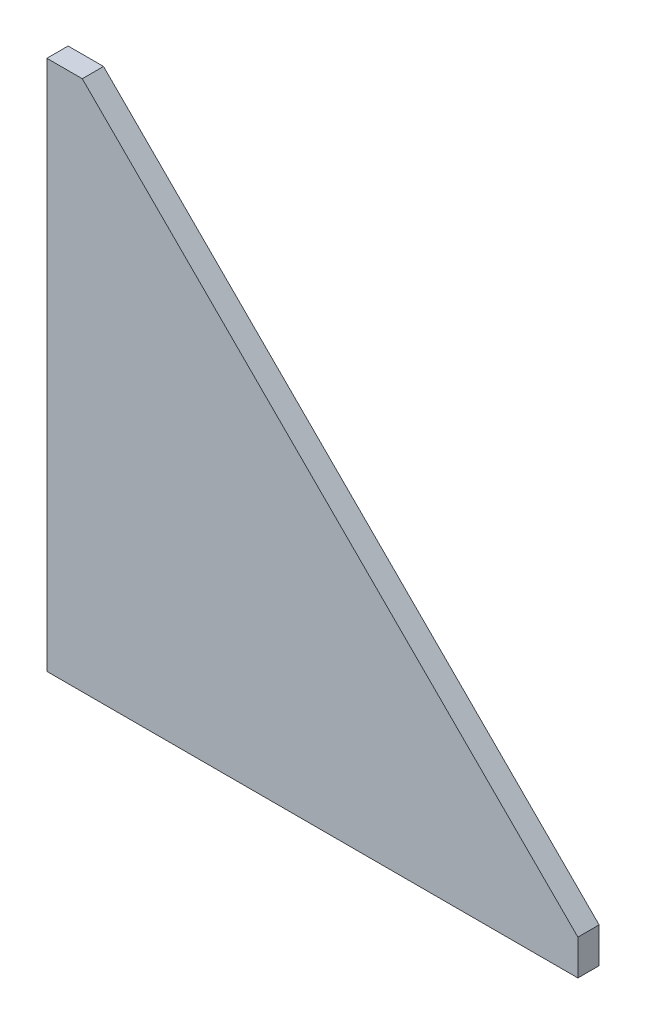
ISO-10303-21;
HEADER;
FILE_DESCRIPTION(('STEP AP214'),'2;1');
FILE_NAME('part.step','',(''),(''),'','','');
FILE_SCHEMA(('AUTOMOTIVE_DESIGN { 1 0 10303 214 1 1 1 1 }'));
ENDSEC;
DATA;
#1=APPLICATION_CONTEXT('core data for automotive mechanical design processes');
#2=APPLICATION_PROTOCOL_DEFINITION('international standard','automotive_design',2000,#1);
#3=PRODUCT_CONTEXT('',#1,'mechanical');
#4=PRODUCT('Part','Part','',(#3));
#5=PRODUCT_RELATED_PRODUCT_CATEGORY('part','',(#4));
#6=PRODUCT_DEFINITION_FORMATION('','',#4);
#7=PRODUCT_DEFINITION_CONTEXT('part definition',#1,'design');
#8=PRODUCT_DEFINITION('design','',#6,#7);
#9=PRODUCT_DEFINITION_SHAPE('','',#8);
#10=(LENGTH_UNIT() NAMED_UNIT(*) SI_UNIT(.MILLI.,.METRE.));
#11=(NAMED_UNIT(*) PLANE_ANGLE_UNIT() SI_UNIT($,.RADIAN.));
#12=(NAMED_UNIT(*) SI_UNIT($,.STERADIAN.) SOLID_ANGLE_UNIT());
#13=UNCERTAINTY_MEASURE_WITH_UNIT(LENGTH_MEASURE(1.E-05),#10,'distance_accuracy_value','');
#14=(GEOMETRIC_REPRESENTATION_CONTEXT(3) GLOBAL_UNCERTAINTY_ASSIGNED_CONTEXT((#13)) GLOBAL_UNIT_ASSIGNED_CONTEXT((#10,
#11,#12)) REPRESENTATION_CONTEXT('',''));
#15=CARTESIAN_POINT('',(0.,0.,0.));
#16=DIRECTION('',(0.,0.,1.));
#17=DIRECTION('',(1.,0.,0.));
#18=AXIS2_PLACEMENT_3D('',#15,#16,#17);
#19=CARTESIAN_POINT('',(0.,150.,-6.));
#20=DIRECTION('',(-1.,0.,0.));
#21=DIRECTION('',(0.,-1.,0.));
#22=AXIS2_PLACEMENT_3D('',#19,#20,#21);
#23=PLANE('',#22);
#24=DIRECTION('',(0.,-1.,0.));
#25=VECTOR('',#24,1.);
#26=CARTESIAN_POINT('',(0.,150.,0.));
#27=LINE('',#26,#25);
#28=CARTESIAN_POINT('',(0.,150.,0.));
#29=VERTEX_POINT('',#28);
#30=CARTESIAN_POINT('',(0.,0.,0.));
#31=VERTEX_POINT('',#30);
#32=EDGE_CURVE('E114',#29,#31,#27,.T.);
#33=ORIENTED_EDGE('',*,*,#32,.F.);
#34=DIRECTION('',(0.,0.,1.));
#35=VECTOR('',#34,1.);
#36=CARTESIAN_POINT('',(0.,150.,-6.));
#37=LINE('',#36,#35);
#38=CARTESIAN_POINT('',(0.,150.,-6.));
#39=VERTEX_POINT('',#38);
#40=EDGE_CURVE('E11',#39,#29,#37,.T.);
#41=ORIENTED_EDGE('',*,*,#40,.F.);
#42=DIRECTION('',(0.,-1.,0.));
#43=VECTOR('',#42,1.);
#44=CARTESIAN_POINT('',(0.,150.,-6.));
#45=LINE('',#44,#43);
#46=CARTESIAN_POINT('',(0.,0.,-6.));
#47=VERTEX_POINT('',#46);
#48=EDGE_CURVE('E109',#39,#47,#45,.T.);
#49=ORIENTED_EDGE('',*,*,#48,.T.);
#50=DIRECTION('',(0.,0.,1.));
#51=VECTOR('',#50,1.);
#52=CARTESIAN_POINT('',(0.,0.,-6.));
#53=LINE('',#52,#51);
#54=EDGE_CURVE('E40',#47,#31,#53,.T.);
#55=ORIENTED_EDGE('',*,*,#54,.T.);
#56=EDGE_LOOP('',(#33,#41,#49,#55));
#57=FACE_BOUND('',#56,.T.);
#58=ADVANCED_FACE('F37',(#57),#23,.T.);
#59=CARTESIAN_POINT('',(10.,150.,-6.));
#60=DIRECTION('',(0.,1.,0.));
#61=DIRECTION('',(-1.,0.,0.));
#62=AXIS2_PLACEMENT_3D('',#59,#60,#61);
#63=PLANE('',#62);
#64=DIRECTION('',(-1.,0.,0.));
#65=VECTOR('',#64,1.);
#66=CARTESIAN_POINT('',(10.,150.,0.));
#67=LINE('',#66,#65);
#68=CARTESIAN_POINT('',(10.,150.,0.));
#69=VERTEX_POINT('',#68);
#70=EDGE_CURVE('E123',#69,#29,#67,.T.);
#71=ORIENTED_EDGE('',*,*,#70,.F.);
#72=DIRECTION('',(0.,0.,1.));
#73=VECTOR('',#72,1.);
#74=CARTESIAN_POINT('',(10.,150.,-6.));
#75=LINE('',#74,#73);
#76=CARTESIAN_POINT('',(10.,150.,-6.));
#77=VERTEX_POINT('',#76);
#78=EDGE_CURVE('E46',#77,#69,#75,.T.);
#79=ORIENTED_EDGE('',*,*,#78,.F.);
#80=DIRECTION('',(-1.,0.,0.));
#81=VECTOR('',#80,1.);
#82=CARTESIAN_POINT('',(10.,150.,-6.));
#83=LINE('',#82,#81);
#84=EDGE_CURVE('E104',#77,#39,#83,.T.);
#85=ORIENTED_EDGE('',*,*,#84,.T.);
#86=ORIENTED_EDGE('',*,*,#40,.T.);
#87=EDGE_LOOP('',(#71,#79,#85,#86));
#88=FACE_BOUND('',#87,.T.);
#89=ADVANCED_FACE('F129',(#88),#63,.T.);
#90=CARTESIAN_POINT('',(150.,10.,-6.));
#91=DIRECTION('',(0.707106781186548,0.707106781186548,0.));
#92=DIRECTION('',(-0.707106781186548,0.707106781186548,0.));
#93=AXIS2_PLACEMENT_3D('',#90,#91,#92);
#94=PLANE('',#93);
#95=DIRECTION('',(-0.707106781186547,0.707106781186547,0.));
#96=VECTOR('',#95,1.);
#97=CARTESIAN_POINT('',(150.,10.,0.));
#98=LINE('',#97,#96);
#99=CARTESIAN_POINT('',(150.,10.,0.));
#100=VERTEX_POINT('',#99);
#101=EDGE_CURVE('E93',#100,#69,#98,.T.);
#102=ORIENTED_EDGE('',*,*,#101,.F.);
#103=DIRECTION('',(0.,0.,1.));
#104=VECTOR('',#103,1.);
#105=CARTESIAN_POINT('',(150.,10.,-6.));
#106=LINE('',#105,#104);
#107=CARTESIAN_POINT('',(150.,10.,-6.));
#108=VERTEX_POINT('',#107);
#109=EDGE_CURVE('E88',#108,#100,#106,.T.);
#110=ORIENTED_EDGE('',*,*,#109,.F.);
#111=DIRECTION('',(-0.707106781186547,0.707106781186547,0.));
#112=VECTOR('',#111,1.);
#113=CARTESIAN_POINT('',(150.,10.,-6.));
#114=LINE('',#113,#112);
#115=EDGE_CURVE('E91',#108,#77,#114,.T.);
#116=ORIENTED_EDGE('',*,*,#115,.T.);
#117=ORIENTED_EDGE('',*,*,#78,.T.);
#118=EDGE_LOOP('',(#102,#110,#116,#117));
#119=FACE_BOUND('',#118,.T.);
#120=ADVANCED_FACE('F90',(#119),#94,.T.);
#121=CARTESIAN_POINT('',(150.,0.,-6.));
#122=DIRECTION('',(1.,0.,0.));
#123=DIRECTION('',(0.,1.,0.));
#124=AXIS2_PLACEMENT_3D('',#121,#122,#123);
#125=PLANE('',#124);
#126=DIRECTION('',(0.,1.,0.));
#127=VECTOR('',#126,1.);
#128=CARTESIAN_POINT('',(150.,0.,0.));
#129=LINE('',#128,#127);
#130=CARTESIAN_POINT('',(150.,0.,0.));
#131=VERTEX_POINT('',#130);
#132=EDGE_CURVE('E120',#131,#100,#129,.T.);
#133=ORIENTED_EDGE('',*,*,#132,.F.);
#134=DIRECTION('',(0.,0.,1.));
#135=VECTOR('',#134,1.);
#136=CARTESIAN_POINT('',(150.,0.,-6.));
#137=LINE('',#136,#135);
#138=CARTESIAN_POINT('',(150.,0.,-6.));
#139=VERTEX_POINT('',#138);
#140=EDGE_CURVE('E98',#139,#131,#137,.T.);
#141=ORIENTED_EDGE('',*,*,#140,.F.);
#142=DIRECTION('',(0.,1.,0.));
#143=VECTOR('',#142,1.);
#144=CARTESIAN_POINT('',(150.,0.,-6.));
#145=LINE('',#144,#143);
#146=EDGE_CURVE('E103',#139,#108,#145,.T.);
#147=ORIENTED_EDGE('',*,*,#146,.T.);
#148=ORIENTED_EDGE('',*,*,#109,.T.);
#149=EDGE_LOOP('',(#133,#141,#147,#148));
#150=FACE_BOUND('',#149,.T.);
#151=ADVANCED_FACE('F106',(#150),#125,.T.);
#152=CARTESIAN_POINT('',(0.,0.,-6.));
#153=DIRECTION('',(0.,-1.,0.));
#154=DIRECTION('',(0.,0.,-1.));
#155=AXIS2_PLACEMENT_3D('',#152,#153,#154);
#156=PLANE('',#155);
#157=DIRECTION('',(1.,0.,0.));
#158=VECTOR('',#157,1.);
#159=CARTESIAN_POINT('',(0.,0.,0.));
#160=LINE('',#159,#158);
#161=EDGE_CURVE('E117',#31,#131,#160,.T.);
#162=ORIENTED_EDGE('',*,*,#161,.F.);
#163=ORIENTED_EDGE('',*,*,#54,.F.);
#164=DIRECTION('',(1.,0.,0.));
#165=VECTOR('',#164,1.);
#166=CARTESIAN_POINT('',(0.,0.,-6.));
#167=LINE('',#166,#165);
#168=EDGE_CURVE('E107',#47,#139,#167,.T.);
#169=ORIENTED_EDGE('',*,*,#168,.T.);
#170=ORIENTED_EDGE('',*,*,#140,.T.);
#171=EDGE_LOOP('',(#162,#163,#169,#170));
#172=FACE_BOUND('',#171,.T.);
#173=ADVANCED_FACE('F126',(#172),#156,.T.);
#174=CARTESIAN_POINT('',(0.,0.,-6.));
#175=DIRECTION('',(0.,0.,1.));
#176=DIRECTION('',(1.,0.,0.));
#177=AXIS2_PLACEMENT_3D('',#174,#175,#176);
#178=PLANE('',#177);
#179=ORIENTED_EDGE('',*,*,#48,.F.);
#180=ORIENTED_EDGE('',*,*,#84,.F.);
#181=ORIENTED_EDGE('',*,*,#115,.F.);
#182=ORIENTED_EDGE('',*,*,#146,.F.);
#183=ORIENTED_EDGE('',*,*,#168,.F.);
#184=EDGE_LOOP('',(#179,#180,#181,#182,#183));
#185=FACE_BOUND('',#184,.T.);
#186=ADVANCED_FACE('F102',(#185),#178,.F.);
#187=CARTESIAN_POINT('',(0.,0.,0.));
#188=DIRECTION('',(0.,0.,1.));
#189=DIRECTION('',(1.,0.,0.));
#190=AXIS2_PLACEMENT_3D('',#187,#188,#189);
#191=PLANE('',#190);
#192=ORIENTED_EDGE('',*,*,#32,.T.);
#193=ORIENTED_EDGE('',*,*,#161,.T.);
#194=ORIENTED_EDGE('',*,*,#132,.T.);
#195=ORIENTED_EDGE('',*,*,#101,.T.);
#196=ORIENTED_EDGE('',*,*,#70,.T.);
#197=EDGE_LOOP('',(#192,#193,#194,#195,#196));
#198=FACE_BOUND('',#197,.T.);
#199=ADVANCED_FACE('F128',(#198),#191,.T.);
#200=CLOSED_SHELL('',(#58,#89,#120,#151,#173,#186,#199));
#201=MANIFOLD_SOLID_BREP('B2',#200);
#202=ADVANCED_BREP_SHAPE_REPRESENTATION('',(#18,#201),#14);
#203=SHAPE_DEFINITION_REPRESENTATION(#9,#202);
ENDSEC;
END-ISO-10303-21;
